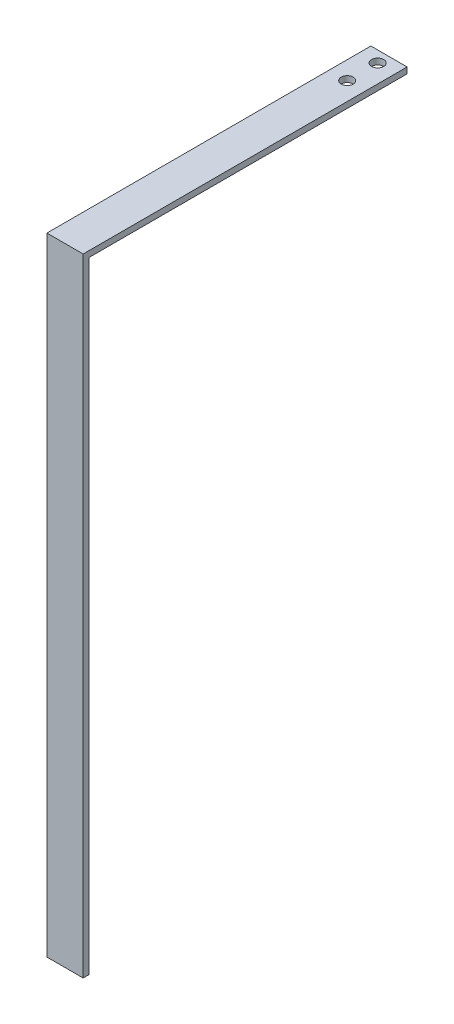
ISO-10303-21;
HEADER;
FILE_DESCRIPTION(('STEP AP214'),'2;1');
FILE_NAME('part.step','',(''),(''),'','','');
FILE_SCHEMA(('AUTOMOTIVE_DESIGN { 1 0 10303 214 1 1 1 1 }'));
ENDSEC;
DATA;
#1=APPLICATION_CONTEXT('core data for automotive mechanical design processes');
#2=APPLICATION_PROTOCOL_DEFINITION('international standard','automotive_design',2000,#1);
#3=PRODUCT_CONTEXT('',#1,'mechanical');
#4=PRODUCT('Part','Part','',(#3));
#5=PRODUCT_RELATED_PRODUCT_CATEGORY('part','',(#4));
#6=PRODUCT_DEFINITION_FORMATION('','',#4);
#7=PRODUCT_DEFINITION_CONTEXT('part definition',#1,'design');
#8=PRODUCT_DEFINITION('design','',#6,#7);
#9=PRODUCT_DEFINITION_SHAPE('','',#8);
#10=(LENGTH_UNIT() NAMED_UNIT(*) SI_UNIT(.MILLI.,.METRE.));
#11=(NAMED_UNIT(*) PLANE_ANGLE_UNIT() SI_UNIT($,.RADIAN.));
#12=(NAMED_UNIT(*) SI_UNIT($,.STERADIAN.) SOLID_ANGLE_UNIT());
#13=UNCERTAINTY_MEASURE_WITH_UNIT(LENGTH_MEASURE(1.E-05),#10,'distance_accuracy_value','');
#14=(GEOMETRIC_REPRESENTATION_CONTEXT(3) GLOBAL_UNCERTAINTY_ASSIGNED_CONTEXT((#13)) GLOBAL_UNIT_ASSIGNED_CONTEXT((#10,
#11,#12)) REPRESENTATION_CONTEXT('',''));
#15=CARTESIAN_POINT('',(0.,0.,0.));
#16=DIRECTION('',(0.,0.,1.));
#17=DIRECTION('',(1.,0.,0.));
#18=AXIS2_PLACEMENT_3D('',#15,#16,#17);
#19=CARTESIAN_POINT('',(-19.05,-3.155,340.39));
#20=DIRECTION('',(0.,1.,0.));
#21=DIRECTION('',(0.,0.,1.));
#22=AXIS2_PLACEMENT_3D('',#19,#20,#21);
#23=PLANE('',#22);
#24=CARTESIAN_POINT('',(-5.55111512312578E-12,-3.155,11.8922046657184));
#25=DIRECTION('',(0.,1.,0.));
#26=DIRECTION('',(0.,0.,1.));
#27=AXIS2_PLACEMENT_3D('',#24,#25,#26);
#28=CIRCLE('',#27,6.34999999999997);
#29=CARTESIAN_POINT('',(-5.55111512312578E-12,-3.155,18.2422046657184));
#30=VERTEX_POINT('',#29);
#31=EDGE_CURVE('E147',#30,#30,#28,.T.);
#32=ORIENTED_EDGE('',*,*,#31,.T.);
#33=EDGE_LOOP('',(#32));
#34=FACE_BOUND('',#33,.T.);
#35=CARTESIAN_POINT('',(-5.44009282066327E-12,-3.155,43.8922046657184));
#36=DIRECTION('',(0.,1.,0.));
#37=DIRECTION('',(0.,0.,1.));
#38=AXIS2_PLACEMENT_3D('',#35,#36,#37);
#39=CIRCLE('',#38,6.34999999999996);
#40=CARTESIAN_POINT('',(-5.44009282066327E-12,-3.155,50.2422046657184));
#41=VERTEX_POINT('',#40);
#42=EDGE_CURVE('E138',#41,#41,#39,.T.);
#43=ORIENTED_EDGE('',*,*,#42,.T.);
#44=EDGE_LOOP('',(#43));
#45=FACE_BOUND('',#44,.T.);
#46=DIRECTION('',(1.,0.,0.));
#47=VECTOR('',#46,1.);
#48=CARTESIAN_POINT('',(19.05,-3.155,334.08));
#49=LINE('',#48,#47);
#50=CARTESIAN_POINT('',(-19.05,-3.155,334.08));
#51=VERTEX_POINT('',#50);
#52=CARTESIAN_POINT('',(19.05,-3.155,334.08));
#53=VERTEX_POINT('',#52);
#54=EDGE_CURVE('E50',#51,#53,#49,.T.);
#55=ORIENTED_EDGE('',*,*,#54,.F.);
#56=DIRECTION('',(0.,0.,-1.));
#57=VECTOR('',#56,1.);
#58=CARTESIAN_POINT('',(-19.05,-3.155,340.39));
#59=LINE('',#58,#57);
#60=CARTESIAN_POINT('',(-19.05,-3.155,0.));
#61=VERTEX_POINT('',#60);
#62=EDGE_CURVE('E86',#51,#61,#59,.T.);
#63=ORIENTED_EDGE('',*,*,#62,.T.);
#64=DIRECTION('',(1.,0.,0.));
#65=VECTOR('',#64,1.);
#66=CARTESIAN_POINT('',(-19.05,-3.155,0.));
#67=LINE('',#66,#65);
#68=CARTESIAN_POINT('',(19.05,-3.155,0.));
#69=VERTEX_POINT('',#68);
#70=EDGE_CURVE('E90',#61,#69,#67,.T.);
#71=ORIENTED_EDGE('',*,*,#70,.T.);
#72=DIRECTION('',(0.,0.,-1.));
#73=VECTOR('',#72,1.);
#74=CARTESIAN_POINT('',(19.05,-3.155,340.39));
#75=LINE('',#74,#73);
#76=EDGE_CURVE('E77',#53,#69,#75,.T.);
#77=ORIENTED_EDGE('',*,*,#76,.F.);
#78=EDGE_LOOP('',(#55,#63,#71,#77));
#79=FACE_BOUND('',#78,.T.);
#80=ADVANCED_FACE('F35',(#34,#45,#79),#23,.F.);
#81=CARTESIAN_POINT('',(19.05,3.155,340.39));
#82=DIRECTION('',(-1.,0.,0.));
#83=DIRECTION('',(0.,0.,1.));
#84=AXIS2_PLACEMENT_3D('',#81,#82,#83);
#85=PLANE('',#84);
#86=DIRECTION('',(0.,1.,0.));
#87=VECTOR('',#86,1.);
#88=CARTESIAN_POINT('',(19.05,3.155,0.));
#89=LINE('',#88,#87);
#90=CARTESIAN_POINT('',(19.05,3.155,0.));
#91=VERTEX_POINT('',#90);
#92=EDGE_CURVE('E81',#69,#91,#89,.T.);
#93=ORIENTED_EDGE('',*,*,#92,.T.);
#94=DIRECTION('',(0.,0.,-1.));
#95=VECTOR('',#94,1.);
#96=CARTESIAN_POINT('',(19.05,3.155,340.39));
#97=LINE('',#96,#95);
#98=CARTESIAN_POINT('',(19.05,3.155,340.39));
#99=VERTEX_POINT('',#98);
#100=EDGE_CURVE('E11',#99,#91,#97,.T.);
#101=ORIENTED_EDGE('',*,*,#100,.F.);
#102=DIRECTION('',(0.,1.,0.));
#103=VECTOR('',#102,1.);
#104=CARTESIAN_POINT('',(19.05,3.155,340.39));
#105=LINE('',#104,#103);
#106=CARTESIAN_POINT('',(19.05,-655.635,340.39));
#107=VERTEX_POINT('',#106);
#108=EDGE_CURVE('E94',#107,#99,#105,.T.);
#109=ORIENTED_EDGE('',*,*,#108,.F.);
#110=DIRECTION('',(0.,0.,1.));
#111=VECTOR('',#110,1.);
#112=CARTESIAN_POINT('',(19.05,-655.635,334.08));
#113=LINE('',#112,#111);
#114=CARTESIAN_POINT('',(19.05,-655.635,334.08));
#115=VERTEX_POINT('',#114);
#116=EDGE_CURVE('E119',#115,#107,#113,.T.);
#117=ORIENTED_EDGE('',*,*,#116,.F.);
#118=DIRECTION('',(0.,1.,0.));
#119=VECTOR('',#118,1.);
#120=CARTESIAN_POINT('',(19.05,-655.635,334.08));
#121=LINE('',#120,#119);
#122=EDGE_CURVE('E85',#115,#53,#121,.T.);
#123=ORIENTED_EDGE('',*,*,#122,.T.);
#124=ORIENTED_EDGE('',*,*,#76,.T.);
#125=EDGE_LOOP('',(#93,#101,#109,#117,#123,#124));
#126=FACE_BOUND('',#125,.T.);
#127=ADVANCED_FACE('F37',(#126),#85,.F.);
#128=CARTESIAN_POINT('',(-19.05,3.155,340.39));
#129=DIRECTION('',(0.,-1.,0.));
#130=DIRECTION('',(0.,0.,-1.));
#131=AXIS2_PLACEMENT_3D('',#128,#129,#130);
#132=PLANE('',#131);
#133=CARTESIAN_POINT('',(-5.55111512312578E-12,3.155,11.8922046657184));
#134=DIRECTION('',(0.,1.,0.));
#135=DIRECTION('',(0.,0.,1.));
#136=AXIS2_PLACEMENT_3D('',#133,#134,#135);
#137=CIRCLE('',#136,6.34999999999997);
#138=CARTESIAN_POINT('',(-5.55111512312578E-12,3.155,18.2422046657184));
#139=VERTEX_POINT('',#138);
#140=EDGE_CURVE('E150',#139,#139,#137,.T.);
#141=ORIENTED_EDGE('',*,*,#140,.F.);
#142=EDGE_LOOP('',(#141));
#143=FACE_BOUND('',#142,.T.);
#144=CARTESIAN_POINT('',(-5.44009282066327E-12,3.155,43.8922046657184));
#145=DIRECTION('',(0.,1.,0.));
#146=DIRECTION('',(0.,0.,1.));
#147=AXIS2_PLACEMENT_3D('',#144,#145,#146);
#148=CIRCLE('',#147,6.34999999999996);
#149=CARTESIAN_POINT('',(-5.44009282066327E-12,3.155,50.2422046657184));
#150=VERTEX_POINT('',#149);
#151=EDGE_CURVE('E142',#150,#150,#148,.T.);
#152=ORIENTED_EDGE('',*,*,#151,.F.);
#153=EDGE_LOOP('',(#152));
#154=FACE_BOUND('',#153,.T.);
#155=DIRECTION('',(-1.,0.,0.));
#156=VECTOR('',#155,1.);
#157=CARTESIAN_POINT('',(-19.05,3.155,0.));
#158=LINE('',#157,#156);
#159=CARTESIAN_POINT('',(-19.05,3.155,0.));
#160=VERTEX_POINT('',#159);
#161=EDGE_CURVE('E98',#91,#160,#158,.T.);
#162=ORIENTED_EDGE('',*,*,#161,.T.);
#163=DIRECTION('',(0.,0.,-1.));
#164=VECTOR('',#163,1.);
#165=CARTESIAN_POINT('',(-19.05,3.155,340.39));
#166=LINE('',#165,#164);
#167=CARTESIAN_POINT('',(-19.05,3.155,340.39));
#168=VERTEX_POINT('',#167);
#169=EDGE_CURVE('E43',#168,#160,#166,.T.);
#170=ORIENTED_EDGE('',*,*,#169,.F.);
#171=DIRECTION('',(-1.,0.,0.));
#172=VECTOR('',#171,1.);
#173=CARTESIAN_POINT('',(-19.05,3.155,340.39));
#174=LINE('',#173,#172);
#175=EDGE_CURVE('E59',#99,#168,#174,.T.);
#176=ORIENTED_EDGE('',*,*,#175,.F.);
#177=ORIENTED_EDGE('',*,*,#100,.T.);
#178=EDGE_LOOP('',(#162,#170,#176,#177));
#179=FACE_BOUND('',#178,.T.);
#180=ADVANCED_FACE('F114',(#143,#154,#179),#132,.F.);
#181=CARTESIAN_POINT('',(-19.05,3.155,340.39));
#182=DIRECTION('',(1.,0.,0.));
#183=DIRECTION('',(0.,0.,-1.));
#184=AXIS2_PLACEMENT_3D('',#181,#182,#183);
#185=PLANE('',#184);
#186=DIRECTION('',(0.,-1.,0.));
#187=VECTOR('',#186,1.);
#188=CARTESIAN_POINT('',(-19.05,3.155,0.));
#189=LINE('',#188,#187);
#190=EDGE_CURVE('E95',#160,#61,#189,.T.);
#191=ORIENTED_EDGE('',*,*,#190,.T.);
#192=ORIENTED_EDGE('',*,*,#62,.F.);
#193=DIRECTION('',(0.,1.,0.));
#194=VECTOR('',#193,1.);
#195=CARTESIAN_POINT('',(-19.05,-655.635,334.08));
#196=LINE('',#195,#194);
#197=CARTESIAN_POINT('',(-19.05,-655.635,334.08));
#198=VERTEX_POINT('',#197);
#199=EDGE_CURVE('E99',#198,#51,#196,.T.);
#200=ORIENTED_EDGE('',*,*,#199,.F.);
#201=DIRECTION('',(0.,0.,-1.));
#202=VECTOR('',#201,1.);
#203=CARTESIAN_POINT('',(-19.05,-655.635,334.08));
#204=LINE('',#203,#202);
#205=CARTESIAN_POINT('',(-19.05,-655.635,340.39));
#206=VERTEX_POINT('',#205);
#207=EDGE_CURVE('E137',#206,#198,#204,.T.);
#208=ORIENTED_EDGE('',*,*,#207,.F.);
#209=DIRECTION('',(0.,-1.,0.));
#210=VECTOR('',#209,1.);
#211=CARTESIAN_POINT('',(-19.05,3.155,340.39));
#212=LINE('',#211,#210);
#213=EDGE_CURVE('E87',#168,#206,#212,.T.);
#214=ORIENTED_EDGE('',*,*,#213,.F.);
#215=ORIENTED_EDGE('',*,*,#169,.T.);
#216=EDGE_LOOP('',(#191,#192,#200,#208,#214,#215));
#217=FACE_BOUND('',#216,.T.);
#218=ADVANCED_FACE('F111',(#217),#185,.F.);
#219=CARTESIAN_POINT('',(0.,0.,340.39));
#220=DIRECTION('',(0.,0.,1.));
#221=DIRECTION('',(1.,0.,0.));
#222=AXIS2_PLACEMENT_3D('',#219,#220,#221);
#223=PLANE('',#222);
#224=ORIENTED_EDGE('',*,*,#108,.T.);
#225=ORIENTED_EDGE('',*,*,#175,.T.);
#226=ORIENTED_EDGE('',*,*,#213,.T.);
#227=DIRECTION('',(-1.,0.,0.));
#228=VECTOR('',#227,1.);
#229=CARTESIAN_POINT('',(19.05,-655.635,340.39));
#230=LINE('',#229,#228);
#231=EDGE_CURVE('E128',#107,#206,#230,.T.);
#232=ORIENTED_EDGE('',*,*,#231,.F.);
#233=EDGE_LOOP('',(#224,#225,#226,#232));
#234=FACE_BOUND('',#233,.T.);
#235=ADVANCED_FACE('F132',(#234),#223,.T.);
#236=CARTESIAN_POINT('',(0.,0.,0.));
#237=DIRECTION('',(0.,0.,1.));
#238=DIRECTION('',(1.,0.,0.));
#239=AXIS2_PLACEMENT_3D('',#236,#237,#238);
#240=PLANE('',#239);
#241=ORIENTED_EDGE('',*,*,#92,.F.);
#242=ORIENTED_EDGE('',*,*,#70,.F.);
#243=ORIENTED_EDGE('',*,*,#190,.F.);
#244=ORIENTED_EDGE('',*,*,#161,.F.);
#245=EDGE_LOOP('',(#241,#242,#243,#244));
#246=FACE_BOUND('',#245,.T.);
#247=ADVANCED_FACE('F97',(#246),#240,.F.);
#248=CARTESIAN_POINT('',(19.05,-655.635,334.08));
#249=DIRECTION('',(0.,0.,1.));
#250=DIRECTION('',(1.,0.,0.));
#251=AXIS2_PLACEMENT_3D('',#248,#249,#250);
#252=PLANE('',#251);
#253=ORIENTED_EDGE('',*,*,#54,.T.);
#254=ORIENTED_EDGE('',*,*,#122,.F.);
#255=DIRECTION('',(1.,0.,0.));
#256=VECTOR('',#255,1.);
#257=CARTESIAN_POINT('',(19.05,-655.635,334.08));
#258=LINE('',#257,#256);
#259=EDGE_CURVE('E130',#198,#115,#258,.T.);
#260=ORIENTED_EDGE('',*,*,#259,.F.);
#261=ORIENTED_EDGE('',*,*,#199,.T.);
#262=EDGE_LOOP('',(#253,#254,#260,#261));
#263=FACE_BOUND('',#262,.T.);
#264=ADVANCED_FACE('F174',(#263),#252,.F.);
#265=CARTESIAN_POINT('',(0.,-655.635,0.));
#266=DIRECTION('',(0.,-1.,0.));
#267=DIRECTION('',(0.,0.,-1.));
#268=AXIS2_PLACEMENT_3D('',#265,#266,#267);
#269=PLANE('',#268);
#270=ORIENTED_EDGE('',*,*,#207,.T.);
#271=ORIENTED_EDGE('',*,*,#259,.T.);
#272=ORIENTED_EDGE('',*,*,#116,.T.);
#273=ORIENTED_EDGE('',*,*,#231,.T.);
#274=EDGE_LOOP('',(#270,#271,#272,#273));
#275=FACE_BOUND('',#274,.T.);
#276=ADVANCED_FACE('F127',(#275),#269,.T.);
#277=CARTESIAN_POINT('',(-5.44009282066327E-12,-3.155,43.8922046657184));
#278=DIRECTION('',(0.,1.,0.));
#279=DIRECTION('',(0.,0.,1.));
#280=AXIS2_PLACEMENT_3D('',#277,#278,#279);
#281=CYLINDRICAL_SURFACE('',#280,6.34999999999996);
#282=ORIENTED_EDGE('',*,*,#42,.F.);
#283=EDGE_LOOP('',(#282));
#284=FACE_BOUND('',#283,.T.);
#285=ORIENTED_EDGE('',*,*,#151,.T.);
#286=EDGE_LOOP('',(#285));
#287=FACE_BOUND('',#286,.T.);
#288=ADVANCED_FACE('F160',(#284,#287),#281,.F.);
#289=CARTESIAN_POINT('',(-5.55111512312578E-12,-3.155,11.8922046657184));
#290=DIRECTION('',(0.,1.,0.));
#291=DIRECTION('',(0.,0.,1.));
#292=AXIS2_PLACEMENT_3D('',#289,#290,#291);
#293=CYLINDRICAL_SURFACE('',#292,6.34999999999997);
#294=ORIENTED_EDGE('',*,*,#31,.F.);
#295=EDGE_LOOP('',(#294));
#296=FACE_BOUND('',#295,.T.);
#297=ORIENTED_EDGE('',*,*,#140,.T.);
#298=EDGE_LOOP('',(#297));
#299=FACE_BOUND('',#298,.T.);
#300=ADVANCED_FACE('F157',(#296,#299),#293,.F.);
#301=CLOSED_SHELL('',(#80,#127,#180,#218,#235,#247,#264,#276,#288,#300));
#302=MANIFOLD_SOLID_BREP('B2',#301);
#303=ADVANCED_BREP_SHAPE_REPRESENTATION('',(#18,#302),#14);
#304=SHAPE_DEFINITION_REPRESENTATION(#9,#303);
ENDSEC;
END-ISO-10303-21;
